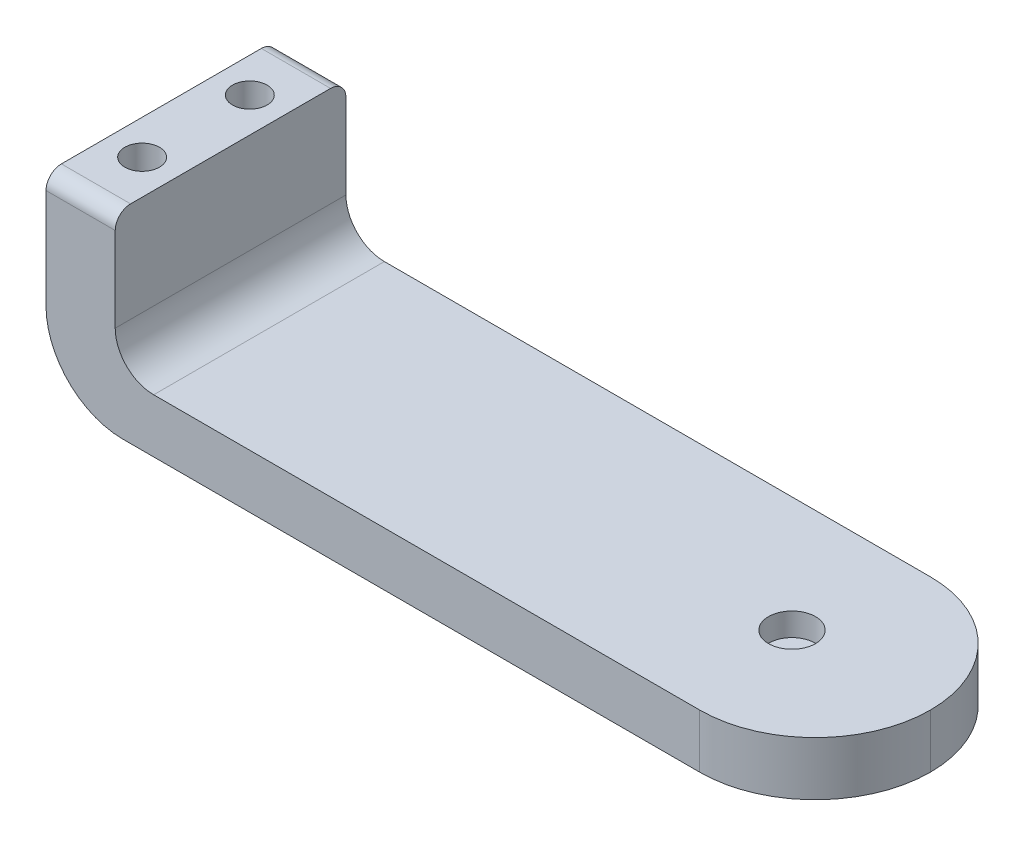
ISO-10303-21;
HEADER;
FILE_DESCRIPTION(('STEP AP214'),'2;1');
FILE_NAME('part.step','',(''),(''),'','','');
FILE_SCHEMA(('AUTOMOTIVE_DESIGN { 1 0 10303 214 1 1 1 1 }'));
ENDSEC;
DATA;
#1=APPLICATION_CONTEXT('core data for automotive mechanical design processes');
#2=APPLICATION_PROTOCOL_DEFINITION('international standard','automotive_design',2000,#1);
#3=PRODUCT_CONTEXT('',#1,'mechanical');
#4=PRODUCT('Part','Part','',(#3));
#5=PRODUCT_RELATED_PRODUCT_CATEGORY('part','',(#4));
#6=PRODUCT_DEFINITION_FORMATION('','',#4);
#7=PRODUCT_DEFINITION_CONTEXT('part definition',#1,'design');
#8=PRODUCT_DEFINITION('design','',#6,#7);
#9=PRODUCT_DEFINITION_SHAPE('','',#8);
#10=(LENGTH_UNIT() NAMED_UNIT(*) SI_UNIT(.MILLI.,.METRE.));
#11=(NAMED_UNIT(*) PLANE_ANGLE_UNIT() SI_UNIT($,.RADIAN.));
#12=(NAMED_UNIT(*) SI_UNIT($,.STERADIAN.) SOLID_ANGLE_UNIT());
#13=UNCERTAINTY_MEASURE_WITH_UNIT(LENGTH_MEASURE(1.E-05),#10,'distance_accuracy_value','');
#14=(GEOMETRIC_REPRESENTATION_CONTEXT(3) GLOBAL_UNCERTAINTY_ASSIGNED_CONTEXT((#13)) GLOBAL_UNIT_ASSIGNED_CONTEXT((#10,
#11,#12)) REPRESENTATION_CONTEXT('',''));
#15=CARTESIAN_POINT('',(0.,0.,0.));
#16=DIRECTION('',(0.,0.,1.));
#17=DIRECTION('',(1.,0.,0.));
#18=AXIS2_PLACEMENT_3D('',#15,#16,#17);
#19=CARTESIAN_POINT('',(-4.5,21.5,30.));
#20=DIRECTION('',(1.,0.,0.));
#21=DIRECTION('',(0.,1.,0.));
#22=AXIS2_PLACEMENT_3D('',#19,#20,#21);
#23=PLANE('',#22);
#24=DIRECTION('',(0.,0.,-1.));
#25=VECTOR('',#24,1.);
#26=CARTESIAN_POINT('',(-4.5,21.5,30.));
#27=LINE('',#26,#25);
#28=CARTESIAN_POINT('',(-4.5,21.5,28.));
#29=VERTEX_POINT('',#28);
#30=CARTESIAN_POINT('',(-4.5,21.5,2.));
#31=VERTEX_POINT('',#30);
#32=EDGE_CURVE('E153',#29,#31,#27,.T.);
#33=ORIENTED_EDGE('',*,*,#32,.T.);
#34=CARTESIAN_POINT('',(-4.5,19.5,2.));
#35=DIRECTION('',(1.,0.,0.));
#36=DIRECTION('',(0.,1.,0.));
#37=AXIS2_PLACEMENT_3D('',#34,#35,#36);
#38=CIRCLE('',#37,2.);
#39=CARTESIAN_POINT('',(-4.5,19.5,0.));
#40=VERTEX_POINT('',#39);
#41=EDGE_CURVE('E195',#31,#40,#38,.F.);
#42=ORIENTED_EDGE('',*,*,#41,.T.);
#43=DIRECTION('',(0.,-1.,0.));
#44=VECTOR('',#43,1.);
#45=CARTESIAN_POINT('',(-4.5,21.5,0.));
#46=LINE('',#45,#44);
#47=CARTESIAN_POINT('',(-4.5,6.5,0.));
#48=VERTEX_POINT('',#47);
#49=EDGE_CURVE('E206',#40,#48,#46,.T.);
#50=ORIENTED_EDGE('',*,*,#49,.T.);
#51=DIRECTION('',(0.,0.,-1.));
#52=VECTOR('',#51,1.);
#53=CARTESIAN_POINT('',(-4.5,6.5,30.));
#54=LINE('',#53,#52);
#55=CARTESIAN_POINT('',(-4.5,6.5,30.));
#56=VERTEX_POINT('',#55);
#57=EDGE_CURVE('E166',#48,#56,#54,.F.);
#58=ORIENTED_EDGE('',*,*,#57,.T.);
#59=DIRECTION('',(0.,-1.,0.));
#60=VECTOR('',#59,1.);
#61=CARTESIAN_POINT('',(-4.5,21.5,30.));
#62=LINE('',#61,#60);
#63=CARTESIAN_POINT('',(-4.5,19.5,30.));
#64=VERTEX_POINT('',#63);
#65=EDGE_CURVE('E144',#64,#56,#62,.T.);
#66=ORIENTED_EDGE('',*,*,#65,.F.);
#67=CARTESIAN_POINT('',(-4.5,19.5,28.));
#68=DIRECTION('',(1.,0.,0.));
#69=DIRECTION('',(0.,1.,0.));
#70=AXIS2_PLACEMENT_3D('',#67,#68,#69);
#71=CIRCLE('',#70,2.);
#72=EDGE_CURVE('E193',#64,#29,#71,.F.);
#73=ORIENTED_EDGE('',*,*,#72,.T.);
#74=EDGE_LOOP('',(#33,#42,#50,#58,#66,#73));
#75=FACE_BOUND('',#74,.T.);
#76=ADVANCED_FACE('F39',(#75),#23,.F.);
#77=CARTESIAN_POINT('',(-4.5,-3.5,30.));
#78=DIRECTION('',(0.,1.,0.));
#79=DIRECTION('',(-1.,0.,0.));
#80=AXIS2_PLACEMENT_3D('',#77,#78,#79);
#81=PLANE('',#80);
#82=CARTESIAN_POINT('',(80.5,-3.50000000000002,15.));
#83=DIRECTION('',(0.,1.,0.));
#84=DIRECTION('',(-1.,0.,0.));
#85=AXIS2_PLACEMENT_3D('',#82,#83,#84);
#86=CIRCLE('',#85,15.);
#87=CARTESIAN_POINT('',(80.5,-3.50000000000002,0.));
#88=VERTEX_POINT('',#87);
#89=CARTESIAN_POINT('',(95.5,-3.50000000000002,15.));
#90=VERTEX_POINT('',#89);
#91=EDGE_CURVE('E178',#88,#90,#86,.F.);
#92=ORIENTED_EDGE('',*,*,#91,.T.);
#93=CARTESIAN_POINT('',(80.5,-3.50000000000002,15.));
#94=DIRECTION('',(0.,1.,0.));
#95=DIRECTION('',(-1.,0.,0.));
#96=AXIS2_PLACEMENT_3D('',#93,#94,#95);
#97=CIRCLE('',#96,15.);
#98=CARTESIAN_POINT('',(80.5,-3.50000000000002,30.));
#99=VERTEX_POINT('',#98);
#100=EDGE_CURVE('E180',#90,#99,#97,.F.);
#101=ORIENTED_EDGE('',*,*,#100,.T.);
#102=DIRECTION('',(1.,0.,0.));
#103=VECTOR('',#102,1.);
#104=CARTESIAN_POINT('',(-4.5,-3.5,30.));
#105=LINE('',#104,#103);
#106=CARTESIAN_POINT('',(5.5,-3.5,30.));
#107=VERTEX_POINT('',#106);
#108=EDGE_CURVE('E147',#107,#99,#105,.T.);
#109=ORIENTED_EDGE('',*,*,#108,.F.);
#110=DIRECTION('',(0.,0.,-1.));
#111=VECTOR('',#110,1.);
#112=CARTESIAN_POINT('',(5.5,-3.5,30.));
#113=LINE('',#112,#111);
#114=CARTESIAN_POINT('',(5.5,-3.5,0.));
#115=VERTEX_POINT('',#114);
#116=EDGE_CURVE('E160',#107,#115,#113,.T.);
#117=ORIENTED_EDGE('',*,*,#116,.T.);
#118=DIRECTION('',(1.,0.,0.));
#119=VECTOR('',#118,1.);
#120=CARTESIAN_POINT('',(-4.5,-3.5,0.));
#121=LINE('',#120,#119);
#122=EDGE_CURVE('E149',#115,#88,#121,.T.);
#123=ORIENTED_EDGE('',*,*,#122,.T.);
#124=EDGE_LOOP('',(#92,#101,#109,#117,#123));
#125=FACE_BOUND('',#124,.T.);
#126=ADVANCED_FACE('F253',(#125),#81,.F.);
#127=CARTESIAN_POINT('',(95.5,3.49999999999998,30.));
#128=DIRECTION('',(0.,-1.,0.));
#129=DIRECTION('',(1.,0.,0.));
#130=AXIS2_PLACEMENT_3D('',#127,#128,#129);
#131=PLANE('',#130);
#132=CARTESIAN_POINT('',(77.5,3.49999999999999,15.));
#133=DIRECTION('',(0.,-1.,0.));
#134=DIRECTION('',(1.,0.,0.));
#135=AXIS2_PLACEMENT_3D('',#132,#133,#134);
#136=CIRCLE('',#135,3.04999999999999);
#137=CARTESIAN_POINT('',(80.55,3.49999999999998,15.));
#138=VERTEX_POINT('',#137);
#139=EDGE_CURVE('E188',#138,#138,#136,.T.);
#140=ORIENTED_EDGE('',*,*,#139,.T.);
#141=EDGE_LOOP('',(#140));
#142=FACE_BOUND('',#141,.T.);
#143=DIRECTION('',(-1.,0.,0.));
#144=VECTOR('',#143,1.);
#145=CARTESIAN_POINT('',(95.5,3.49999999999998,30.));
#146=LINE('',#145,#144);
#147=CARTESIAN_POINT('',(80.5,3.49999999999998,30.));
#148=VERTEX_POINT('',#147);
#149=CARTESIAN_POINT('',(9.49999999999999,3.5,30.));
#150=VERTEX_POINT('',#149);
#151=EDGE_CURVE('E217',#148,#150,#146,.T.);
#152=ORIENTED_EDGE('',*,*,#151,.F.);
#153=CARTESIAN_POINT('',(80.5,3.49999999999998,15.));
#154=DIRECTION('',(0.,-1.,0.));
#155=DIRECTION('',(1.,0.,0.));
#156=AXIS2_PLACEMENT_3D('',#153,#154,#155);
#157=CIRCLE('',#156,15.);
#158=CARTESIAN_POINT('',(95.5,3.49999999999998,15.));
#159=VERTEX_POINT('',#158);
#160=EDGE_CURVE('E176',#148,#159,#157,.F.);
#161=ORIENTED_EDGE('',*,*,#160,.T.);
#162=CARTESIAN_POINT('',(80.5,3.49999999999998,15.));
#163=DIRECTION('',(0.,-1.,0.));
#164=DIRECTION('',(1.,0.,0.));
#165=AXIS2_PLACEMENT_3D('',#162,#163,#164);
#166=CIRCLE('',#165,15.);
#167=CARTESIAN_POINT('',(80.5,3.49999999999998,0.));
#168=VERTEX_POINT('',#167);
#169=EDGE_CURVE('E174',#159,#168,#166,.F.);
#170=ORIENTED_EDGE('',*,*,#169,.T.);
#171=DIRECTION('',(-1.,0.,0.));
#172=VECTOR('',#171,1.);
#173=CARTESIAN_POINT('',(95.5,3.49999999999998,0.));
#174=LINE('',#173,#172);
#175=CARTESIAN_POINT('',(9.49999999999999,3.5,0.));
#176=VERTEX_POINT('',#175);
#177=EDGE_CURVE('E145',#168,#176,#174,.T.);
#178=ORIENTED_EDGE('',*,*,#177,.T.);
#179=DIRECTION('',(0.,0.,-1.));
#180=VECTOR('',#179,1.);
#181=CARTESIAN_POINT('',(9.5,3.5,30.));
#182=LINE('',#181,#180);
#183=EDGE_CURVE('E133',#176,#150,#182,.F.);
#184=ORIENTED_EDGE('',*,*,#183,.T.);
#185=EDGE_LOOP('',(#152,#161,#170,#178,#184));
#186=FACE_BOUND('',#185,.T.);
#187=ADVANCED_FACE('F259',(#142,#186),#131,.F.);
#188=CARTESIAN_POINT('',(4.5,3.5,30.));
#189=DIRECTION('',(-1.,0.,0.));
#190=DIRECTION('',(0.,-1.,0.));
#191=AXIS2_PLACEMENT_3D('',#188,#189,#190);
#192=PLANE('',#191);
#193=DIRECTION('',(0.,1.,0.));
#194=VECTOR('',#193,1.);
#195=CARTESIAN_POINT('',(4.5,3.5,0.));
#196=LINE('',#195,#194);
#197=CARTESIAN_POINT('',(4.5,8.49999999999999,0.));
#198=VERTEX_POINT('',#197);
#199=CARTESIAN_POINT('',(4.5,19.5,0.));
#200=VERTEX_POINT('',#199);
#201=EDGE_CURVE('E138',#198,#200,#196,.T.);
#202=ORIENTED_EDGE('',*,*,#201,.T.);
#203=CARTESIAN_POINT('',(4.5,19.5,2.));
#204=DIRECTION('',(-1.,0.,0.));
#205=DIRECTION('',(0.,-1.,0.));
#206=AXIS2_PLACEMENT_3D('',#203,#204,#205);
#207=CIRCLE('',#206,2.);
#208=CARTESIAN_POINT('',(4.5,21.5,2.));
#209=VERTEX_POINT('',#208);
#210=EDGE_CURVE('E47',#200,#209,#207,.F.);
#211=ORIENTED_EDGE('',*,*,#210,.T.);
#212=DIRECTION('',(0.,0.,-1.));
#213=VECTOR('',#212,1.);
#214=CARTESIAN_POINT('',(4.5,21.5,30.));
#215=LINE('',#214,#213);
#216=CARTESIAN_POINT('',(4.5,21.5,28.));
#217=VERTEX_POINT('',#216);
#218=EDGE_CURVE('E141',#217,#209,#215,.T.);
#219=ORIENTED_EDGE('',*,*,#218,.F.);
#220=CARTESIAN_POINT('',(4.5,19.5,28.));
#221=DIRECTION('',(-1.,0.,0.));
#222=DIRECTION('',(0.,-1.,0.));
#223=AXIS2_PLACEMENT_3D('',#220,#221,#222);
#224=CIRCLE('',#223,2.);
#225=CARTESIAN_POINT('',(4.5,19.5,30.));
#226=VERTEX_POINT('',#225);
#227=EDGE_CURVE('E54',#217,#226,#224,.F.);
#228=ORIENTED_EDGE('',*,*,#227,.T.);
#229=DIRECTION('',(0.,1.,0.));
#230=VECTOR('',#229,1.);
#231=CARTESIAN_POINT('',(4.5,3.5,30.));
#232=LINE('',#231,#230);
#233=CARTESIAN_POINT('',(4.5,8.49999999999999,30.));
#234=VERTEX_POINT('',#233);
#235=EDGE_CURVE('E140',#234,#226,#232,.T.);
#236=ORIENTED_EDGE('',*,*,#235,.F.);
#237=DIRECTION('',(0.,0.,-1.));
#238=VECTOR('',#237,1.);
#239=CARTESIAN_POINT('',(4.5,8.49999999999999,0.));
#240=LINE('',#239,#238);
#241=EDGE_CURVE('E131',#234,#198,#240,.T.);
#242=ORIENTED_EDGE('',*,*,#241,.T.);
#243=EDGE_LOOP('',(#202,#211,#219,#228,#236,#242));
#244=FACE_BOUND('',#243,.T.);
#245=ADVANCED_FACE('F137',(#244),#192,.F.);
#246=CARTESIAN_POINT('',(-4.5,21.5,30.));
#247=DIRECTION('',(0.,-1.,0.));
#248=DIRECTION('',(0.,0.,-1.));
#249=AXIS2_PLACEMENT_3D('',#246,#247,#248);
#250=PLANE('',#249);
#251=CARTESIAN_POINT('',(0.,21.5,22.));
#252=DIRECTION('',(0.,1.,0.));
#253=DIRECTION('',(0.,0.,1.));
#254=AXIS2_PLACEMENT_3D('',#251,#252,#253);
#255=CIRCLE('',#254,2.25);
#256=CARTESIAN_POINT('',(0.,21.5,24.25));
#257=VERTEX_POINT('',#256);
#258=EDGE_CURVE('E213',#257,#257,#255,.T.);
#259=ORIENTED_EDGE('',*,*,#258,.F.);
#260=EDGE_LOOP('',(#259));
#261=FACE_BOUND('',#260,.T.);
#262=CARTESIAN_POINT('',(0.,21.5,8.));
#263=DIRECTION('',(0.,1.,0.));
#264=DIRECTION('',(0.,0.,1.));
#265=AXIS2_PLACEMENT_3D('',#262,#263,#264);
#266=CIRCLE('',#265,2.25);
#267=CARTESIAN_POINT('',(0.,21.5,10.25));
#268=VERTEX_POINT('',#267);
#269=EDGE_CURVE('E224',#268,#268,#266,.T.);
#270=ORIENTED_EDGE('',*,*,#269,.F.);
#271=EDGE_LOOP('',(#270));
#272=FACE_BOUND('',#271,.T.);
#273=ORIENTED_EDGE('',*,*,#218,.T.);
#274=DIRECTION('',(-1.,0.,0.));
#275=VECTOR('',#274,1.);
#276=CARTESIAN_POINT('',(-4.5,21.5,2.));
#277=LINE('',#276,#275);
#278=EDGE_CURVE('E190',#209,#31,#277,.T.);
#279=ORIENTED_EDGE('',*,*,#278,.T.);
#280=ORIENTED_EDGE('',*,*,#32,.F.);
#281=DIRECTION('',(-1.,0.,0.));
#282=VECTOR('',#281,1.);
#283=CARTESIAN_POINT('',(4.5,21.5,28.));
#284=LINE('',#283,#282);
#285=EDGE_CURVE('E184',#29,#217,#284,.F.);
#286=ORIENTED_EDGE('',*,*,#285,.T.);
#287=EDGE_LOOP('',(#273,#279,#280,#286));
#288=FACE_BOUND('',#287,.T.);
#289=ADVANCED_FACE('F201',(#261,#272,#288),#250,.F.);
#290=CARTESIAN_POINT('',(0.,0.,30.));
#291=DIRECTION('',(0.,0.,1.));
#292=DIRECTION('',(1.,0.,0.));
#293=AXIS2_PLACEMENT_3D('',#290,#291,#292);
#294=PLANE('',#293);
#295=ORIENTED_EDGE('',*,*,#235,.T.);
#296=DIRECTION('',(-1.,0.,0.));
#297=VECTOR('',#296,1.);
#298=CARTESIAN_POINT('',(-4.5,19.5,30.));
#299=LINE('',#298,#297);
#300=EDGE_CURVE('E11',#226,#64,#299,.T.);
#301=ORIENTED_EDGE('',*,*,#300,.T.);
#302=ORIENTED_EDGE('',*,*,#65,.T.);
#303=CARTESIAN_POINT('',(5.5,6.5,30.));
#304=DIRECTION('',(0.,0.,1.));
#305=DIRECTION('',(1.,0.,0.));
#306=AXIS2_PLACEMENT_3D('',#303,#304,#305);
#307=CIRCLE('',#306,10.);
#308=EDGE_CURVE('E169',#56,#107,#307,.T.);
#309=ORIENTED_EDGE('',*,*,#308,.T.);
#310=ORIENTED_EDGE('',*,*,#108,.T.);
#311=DIRECTION('',(0.,1.,0.));
#312=VECTOR('',#311,1.);
#313=CARTESIAN_POINT('',(80.5,3.49999999999998,30.));
#314=LINE('',#313,#312);
#315=EDGE_CURVE('E171',#99,#148,#314,.T.);
#316=ORIENTED_EDGE('',*,*,#315,.T.);
#317=ORIENTED_EDGE('',*,*,#151,.T.);
#318=CARTESIAN_POINT('',(9.5,8.5,30.));
#319=DIRECTION('',(0.,0.,1.));
#320=DIRECTION('',(1.,0.,0.));
#321=AXIS2_PLACEMENT_3D('',#318,#319,#320);
#322=CIRCLE('',#321,5.);
#323=EDGE_CURVE('E135',#150,#234,#322,.F.);
#324=ORIENTED_EDGE('',*,*,#323,.T.);
#325=EDGE_LOOP('',(#295,#301,#302,#309,#310,#316,#317,#324));
#326=FACE_BOUND('',#325,.T.);
#327=ADVANCED_FACE('F282',(#326),#294,.T.);
#328=CARTESIAN_POINT('',(0.,0.,0.));
#329=DIRECTION('',(0.,0.,1.));
#330=DIRECTION('',(1.,0.,0.));
#331=AXIS2_PLACEMENT_3D('',#328,#329,#330);
#332=PLANE('',#331);
#333=ORIENTED_EDGE('',*,*,#49,.F.);
#334=DIRECTION('',(-1.,0.,0.));
#335=VECTOR('',#334,1.);
#336=CARTESIAN_POINT('',(0.,19.5,0.));
#337=LINE('',#336,#335);
#338=EDGE_CURVE('E62',#40,#200,#337,.F.);
#339=ORIENTED_EDGE('',*,*,#338,.T.);
#340=ORIENTED_EDGE('',*,*,#201,.F.);
#341=CARTESIAN_POINT('',(9.5,8.5,0.));
#342=DIRECTION('',(0.,0.,1.));
#343=DIRECTION('',(1.,0.,0.));
#344=AXIS2_PLACEMENT_3D('',#341,#342,#343);
#345=CIRCLE('',#344,5.);
#346=EDGE_CURVE('E127',#198,#176,#345,.T.);
#347=ORIENTED_EDGE('',*,*,#346,.T.);
#348=ORIENTED_EDGE('',*,*,#177,.F.);
#349=DIRECTION('',(0.,1.,0.));
#350=VECTOR('',#349,1.);
#351=CARTESIAN_POINT('',(80.5,0.,0.));
#352=LINE('',#351,#350);
#353=EDGE_CURVE('E182',#168,#88,#352,.F.);
#354=ORIENTED_EDGE('',*,*,#353,.T.);
#355=ORIENTED_EDGE('',*,*,#122,.F.);
#356=CARTESIAN_POINT('',(5.5,6.5,0.));
#357=DIRECTION('',(0.,0.,1.));
#358=DIRECTION('',(1.,0.,0.));
#359=AXIS2_PLACEMENT_3D('',#356,#357,#358);
#360=CIRCLE('',#359,10.);
#361=EDGE_CURVE('E163',#115,#48,#360,.F.);
#362=ORIENTED_EDGE('',*,*,#361,.T.);
#363=EDGE_LOOP('',(#333,#339,#340,#347,#348,#354,#355,#362));
#364=FACE_BOUND('',#363,.T.);
#365=ADVANCED_FACE('F143',(#364),#332,.F.);
#366=CARTESIAN_POINT('',(0.,15.5,8.));
#367=DIRECTION('',(0.,1.,0.));
#368=DIRECTION('',(0.,0.,1.));
#369=AXIS2_PLACEMENT_3D('',#366,#367,#368);
#370=CYLINDRICAL_SURFACE('',#369,2.25);
#371=CARTESIAN_POINT('',(0.,15.5,8.));
#372=DIRECTION('',(0.,1.,0.));
#373=DIRECTION('',(0.,0.,1.));
#374=AXIS2_PLACEMENT_3D('',#371,#372,#373);
#375=CIRCLE('',#374,2.25);
#376=CARTESIAN_POINT('',(0.,15.5,10.25));
#377=VERTEX_POINT('',#376);
#378=EDGE_CURVE('E221',#377,#377,#375,.T.);
#379=ORIENTED_EDGE('',*,*,#378,.F.);
#380=EDGE_LOOP('',(#379));
#381=FACE_BOUND('',#380,.T.);
#382=ORIENTED_EDGE('',*,*,#269,.T.);
#383=EDGE_LOOP('',(#382));
#384=FACE_BOUND('',#383,.T.);
#385=ADVANCED_FACE('F304',(#381,#384),#370,.F.);
#386=CARTESIAN_POINT('',(0.,15.5,8.));
#387=DIRECTION('',(0.,1.,0.));
#388=DIRECTION('',(0.,0.,1.));
#389=AXIS2_PLACEMENT_3D('',#386,#387,#388);
#390=PLANE('',#389);
#391=ORIENTED_EDGE('',*,*,#378,.T.);
#392=EDGE_LOOP('',(#391));
#393=FACE_BOUND('',#392,.T.);
#394=ADVANCED_FACE('F307',(#393),#390,.T.);
#395=CARTESIAN_POINT('',(0.,15.5,22.));
#396=DIRECTION('',(0.,1.,0.));
#397=DIRECTION('',(0.,0.,1.));
#398=AXIS2_PLACEMENT_3D('',#395,#396,#397);
#399=CYLINDRICAL_SURFACE('',#398,2.25);
#400=CARTESIAN_POINT('',(0.,15.5,22.));
#401=DIRECTION('',(0.,1.,0.));
#402=DIRECTION('',(0.,0.,1.));
#403=AXIS2_PLACEMENT_3D('',#400,#401,#402);
#404=CIRCLE('',#403,2.25);
#405=CARTESIAN_POINT('',(0.,15.5,24.25));
#406=VERTEX_POINT('',#405);
#407=EDGE_CURVE('E209',#406,#406,#404,.T.);
#408=ORIENTED_EDGE('',*,*,#407,.F.);
#409=EDGE_LOOP('',(#408));
#410=FACE_BOUND('',#409,.T.);
#411=ORIENTED_EDGE('',*,*,#258,.T.);
#412=EDGE_LOOP('',(#411));
#413=FACE_BOUND('',#412,.T.);
#414=ADVANCED_FACE('F310',(#410,#413),#399,.F.);
#415=CARTESIAN_POINT('',(0.,15.5,22.));
#416=DIRECTION('',(0.,1.,0.));
#417=DIRECTION('',(0.,0.,1.));
#418=AXIS2_PLACEMENT_3D('',#415,#416,#417);
#419=PLANE('',#418);
#420=ORIENTED_EDGE('',*,*,#407,.T.);
#421=EDGE_LOOP('',(#420));
#422=FACE_BOUND('',#421,.T.);
#423=ADVANCED_FACE('F266',(#422),#419,.T.);
#424=CARTESIAN_POINT('',(9.5,8.5,30.));
#425=DIRECTION('',(0.,0.,1.));
#426=DIRECTION('',(1.,0.,0.));
#427=AXIS2_PLACEMENT_3D('',#424,#425,#426);
#428=CYLINDRICAL_SURFACE('',#427,5.);
#429=ORIENTED_EDGE('',*,*,#323,.F.);
#430=ORIENTED_EDGE('',*,*,#183,.F.);
#431=ORIENTED_EDGE('',*,*,#346,.F.);
#432=ORIENTED_EDGE('',*,*,#241,.F.);
#433=EDGE_LOOP('',(#429,#430,#431,#432));
#434=FACE_BOUND('',#433,.T.);
#435=ADVANCED_FACE('F130',(#434),#428,.F.);
#436=CARTESIAN_POINT('',(5.5,6.5,30.));
#437=DIRECTION('',(0.,0.,-1.));
#438=DIRECTION('',(-1.,0.,0.));
#439=AXIS2_PLACEMENT_3D('',#436,#437,#438);
#440=CYLINDRICAL_SURFACE('',#439,10.);
#441=ORIENTED_EDGE('',*,*,#308,.F.);
#442=ORIENTED_EDGE('',*,*,#57,.F.);
#443=ORIENTED_EDGE('',*,*,#361,.F.);
#444=ORIENTED_EDGE('',*,*,#116,.F.);
#445=EDGE_LOOP('',(#441,#442,#443,#444));
#446=FACE_BOUND('',#445,.T.);
#447=ADVANCED_FACE('F250',(#446),#440,.T.);
#448=CARTESIAN_POINT('',(77.5,0.499999999999985,15.));
#449=DIRECTION('',(0.,1.,0.));
#450=DIRECTION('',(-1.,0.,0.));
#451=AXIS2_PLACEMENT_3D('',#448,#449,#450);
#452=CYLINDRICAL_SURFACE('',#451,3.04999999999999);
#453=CARTESIAN_POINT('',(77.5,0.499999999999985,15.));
#454=DIRECTION('',(0.,-1.,0.));
#455=DIRECTION('',(1.,0.,0.));
#456=AXIS2_PLACEMENT_3D('',#453,#454,#455);
#457=CIRCLE('',#456,3.04999999999999);
#458=CARTESIAN_POINT('',(80.55,0.499999999999985,15.));
#459=VERTEX_POINT('',#458);
#460=EDGE_CURVE('E225',#459,#459,#457,.T.);
#461=ORIENTED_EDGE('',*,*,#460,.T.);
#462=EDGE_LOOP('',(#461));
#463=FACE_BOUND('',#462,.T.);
#464=ORIENTED_EDGE('',*,*,#139,.F.);
#465=EDGE_LOOP('',(#464));
#466=FACE_BOUND('',#465,.T.);
#467=ADVANCED_FACE('F235',(#463,#466),#452,.F.);
#468=CARTESIAN_POINT('',(77.5,0.499999999999985,15.));
#469=DIRECTION('',(0.,-1.,0.));
#470=DIRECTION('',(1.,0.,0.));
#471=AXIS2_PLACEMENT_3D('',#468,#469,#470);
#472=PLANE('',#471);
#473=ORIENTED_EDGE('',*,*,#460,.F.);
#474=EDGE_LOOP('',(#473));
#475=FACE_BOUND('',#474,.T.);
#476=ADVANCED_FACE('F238',(#475),#472,.F.);
#477=CARTESIAN_POINT('',(80.5,-3.50000000000002,15.));
#478=DIRECTION('',(0.,1.,0.));
#479=DIRECTION('',(0.,0.,1.));
#480=AXIS2_PLACEMENT_3D('',#477,#478,#479);
#481=CYLINDRICAL_SURFACE('',#480,15.);
#482=DIRECTION('',(0.,1.,0.));
#483=VECTOR('',#482,1.);
#484=CARTESIAN_POINT('',(95.5,-3.50000000000002,15.));
#485=LINE('',#484,#483);
#486=EDGE_CURVE('E185',#90,#159,#485,.T.);
#487=ORIENTED_EDGE('',*,*,#486,.F.);
#488=ORIENTED_EDGE('',*,*,#91,.F.);
#489=ORIENTED_EDGE('',*,*,#353,.F.);
#490=ORIENTED_EDGE('',*,*,#169,.F.);
#491=EDGE_LOOP('',(#487,#488,#489,#490));
#492=FACE_BOUND('',#491,.T.);
#493=ADVANCED_FACE('F240',(#492),#481,.T.);
#494=CARTESIAN_POINT('',(80.5,0.,15.));
#495=DIRECTION('',(0.,-1.,0.));
#496=DIRECTION('',(0.,0.,-1.));
#497=AXIS2_PLACEMENT_3D('',#494,#495,#496);
#498=CYLINDRICAL_SURFACE('',#497,15.);
#499=ORIENTED_EDGE('',*,*,#100,.F.);
#500=ORIENTED_EDGE('',*,*,#486,.T.);
#501=ORIENTED_EDGE('',*,*,#160,.F.);
#502=ORIENTED_EDGE('',*,*,#315,.F.);
#503=EDGE_LOOP('',(#499,#500,#501,#502));
#504=FACE_BOUND('',#503,.T.);
#505=ADVANCED_FACE('F247',(#504),#498,.T.);
#506=CARTESIAN_POINT('',(-4.5,19.5,2.));
#507=DIRECTION('',(-1.,0.,0.));
#508=DIRECTION('',(0.,0.,1.));
#509=AXIS2_PLACEMENT_3D('',#506,#507,#508);
#510=CYLINDRICAL_SURFACE('',#509,2.);
#511=ORIENTED_EDGE('',*,*,#210,.F.);
#512=ORIENTED_EDGE('',*,*,#338,.F.);
#513=ORIENTED_EDGE('',*,*,#41,.F.);
#514=ORIENTED_EDGE('',*,*,#278,.F.);
#515=EDGE_LOOP('',(#511,#512,#513,#514));
#516=FACE_BOUND('',#515,.T.);
#517=ADVANCED_FACE('F204',(#516),#510,.T.);
#518=CARTESIAN_POINT('',(0.,19.5,28.));
#519=DIRECTION('',(1.,0.,0.));
#520=DIRECTION('',(0.,0.,-1.));
#521=AXIS2_PLACEMENT_3D('',#518,#519,#520);
#522=CYLINDRICAL_SURFACE('',#521,2.);
#523=ORIENTED_EDGE('',*,*,#227,.F.);
#524=ORIENTED_EDGE('',*,*,#285,.F.);
#525=ORIENTED_EDGE('',*,*,#72,.F.);
#526=ORIENTED_EDGE('',*,*,#300,.F.);
#527=EDGE_LOOP('',(#523,#524,#525,#526));
#528=FACE_BOUND('',#527,.T.);
#529=ADVANCED_FACE('F41',(#528),#522,.T.);
#530=CLOSED_SHELL('',(#76,#126,#187,#245,#289,#327,#365,#385,#394,#414,#423,#435,#447,#467,#476,
#493,#505,#517,#529));
#531=MANIFOLD_SOLID_BREP('B2',#530);
#532=ADVANCED_BREP_SHAPE_REPRESENTATION('',(#18,#531),#14);
#533=SHAPE_DEFINITION_REPRESENTATION(#9,#532);
ENDSEC;
END-ISO-10303-21;
